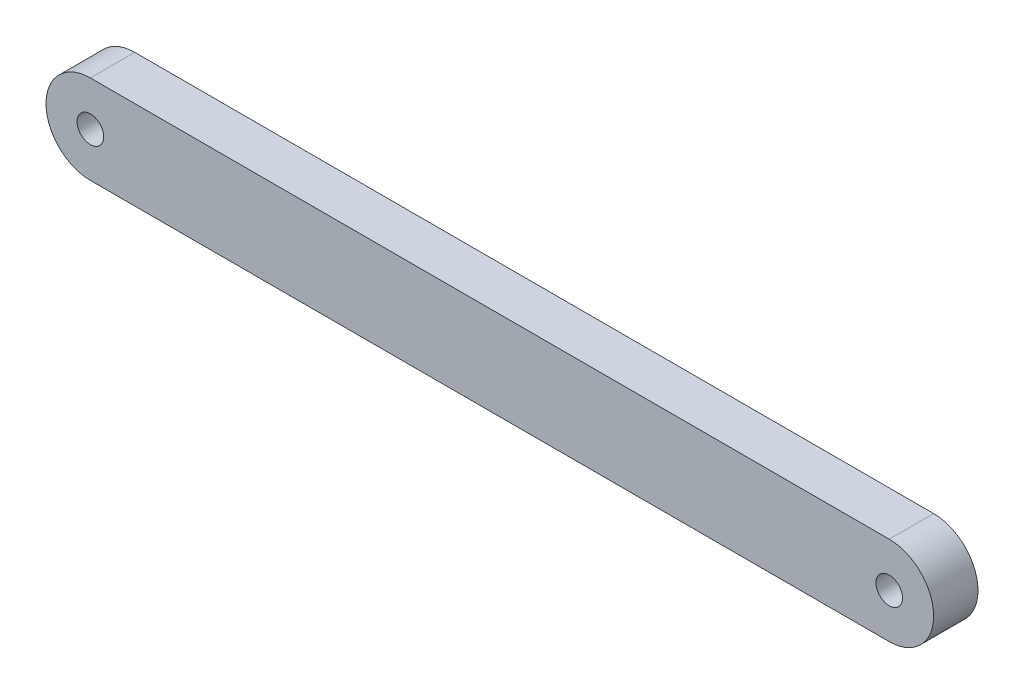
ISO-10303-21;
HEADER;
FILE_DESCRIPTION(('STEP AP214'),'2;1');
FILE_NAME('part.step','',(''),(''),'','','');
FILE_SCHEMA(('AUTOMOTIVE_DESIGN { 1 0 10303 214 1 1 1 1 }'));
ENDSEC;
DATA;
#1=APPLICATION_CONTEXT('core data for automotive mechanical design processes');
#2=APPLICATION_PROTOCOL_DEFINITION('international standard','automotive_design',2000,#1);
#3=PRODUCT_CONTEXT('',#1,'mechanical');
#4=PRODUCT('Part','Part','',(#3));
#5=PRODUCT_RELATED_PRODUCT_CATEGORY('part','',(#4));
#6=PRODUCT_DEFINITION_FORMATION('','',#4);
#7=PRODUCT_DEFINITION_CONTEXT('part definition',#1,'design');
#8=PRODUCT_DEFINITION('design','',#6,#7);
#9=PRODUCT_DEFINITION_SHAPE('','',#8);
#10=(LENGTH_UNIT() NAMED_UNIT(*) SI_UNIT(.MILLI.,.METRE.));
#11=(NAMED_UNIT(*) PLANE_ANGLE_UNIT() SI_UNIT($,.RADIAN.));
#12=(NAMED_UNIT(*) SI_UNIT($,.STERADIAN.) SOLID_ANGLE_UNIT());
#13=UNCERTAINTY_MEASURE_WITH_UNIT(LENGTH_MEASURE(1.E-05),#10,'distance_accuracy_value','');
#14=(GEOMETRIC_REPRESENTATION_CONTEXT(3) GLOBAL_UNCERTAINTY_ASSIGNED_CONTEXT((#13)) GLOBAL_UNIT_ASSIGNED_CONTEXT((#10,
#11,#12)) REPRESENTATION_CONTEXT('',''));
#15=CARTESIAN_POINT('',(0.,0.,0.));
#16=DIRECTION('',(0.,0.,1.));
#17=DIRECTION('',(1.,0.,0.));
#18=AXIS2_PLACEMENT_3D('',#15,#16,#17);
#19=CARTESIAN_POINT('',(-45.,0.,5.));
#20=DIRECTION('',(0.,0.,1.));
#21=DIRECTION('',(1.,0.,0.));
#22=AXIS2_PLACEMENT_3D('',#19,#20,#21);
#23=PLANE('',#22);
#24=CARTESIAN_POINT('',(-45.,0.,5.));
#25=DIRECTION('',(0.,0.,1.));
#26=DIRECTION('',(1.,0.,0.));
#27=AXIS2_PLACEMENT_3D('',#24,#25,#26);
#28=CIRCLE('',#27,1.5);
#29=CARTESIAN_POINT('',(-43.5,0.,5.));
#30=VERTEX_POINT('',#29);
#31=EDGE_CURVE('E100',#30,#30,#28,.T.);
#32=ORIENTED_EDGE('',*,*,#31,.F.);
#33=EDGE_LOOP('',(#32));
#34=FACE_BOUND('',#33,.T.);
#35=CARTESIAN_POINT('',(-45.,0.,5.));
#36=DIRECTION('',(0.,0.,1.));
#37=DIRECTION('',(1.,0.,0.));
#38=AXIS2_PLACEMENT_3D('',#35,#36,#37);
#39=CIRCLE('',#38,5.);
#40=CARTESIAN_POINT('',(-45.,5.,5.));
#41=VERTEX_POINT('',#40);
#42=CARTESIAN_POINT('',(-45.,-5.,5.));
#43=VERTEX_POINT('',#42);
#44=EDGE_CURVE('E85',#41,#43,#39,.T.);
#45=ORIENTED_EDGE('',*,*,#44,.T.);
#46=DIRECTION('',(1.,0.,0.));
#47=VECTOR('',#46,1.);
#48=CARTESIAN_POINT('',(-45.,-5.,5.));
#49=LINE('',#48,#47);
#50=CARTESIAN_POINT('',(45.,-5.,5.));
#51=VERTEX_POINT('',#50);
#52=EDGE_CURVE('E80',#43,#51,#49,.T.);
#53=ORIENTED_EDGE('',*,*,#52,.T.);
#54=CARTESIAN_POINT('',(45.,0.,5.));
#55=DIRECTION('',(0.,0.,1.));
#56=DIRECTION('',(1.,0.,0.));
#57=AXIS2_PLACEMENT_3D('',#54,#55,#56);
#58=CIRCLE('',#57,5.);
#59=CARTESIAN_POINT('',(45.,5.,5.));
#60=VERTEX_POINT('',#59);
#61=EDGE_CURVE('E83',#51,#60,#58,.T.);
#62=ORIENTED_EDGE('',*,*,#61,.T.);
#63=DIRECTION('',(-1.,0.,0.));
#64=VECTOR('',#63,1.);
#65=CARTESIAN_POINT('',(-45.,5.,5.));
#66=LINE('',#65,#64);
#67=EDGE_CURVE('E50',#60,#41,#66,.T.);
#68=ORIENTED_EDGE('',*,*,#67,.T.);
#69=EDGE_LOOP('',(#45,#53,#62,#68));
#70=FACE_BOUND('',#69,.T.);
#71=CARTESIAN_POINT('',(45.,0.,5.));
#72=DIRECTION('',(0.,0.,1.));
#73=DIRECTION('',(1.,0.,0.));
#74=AXIS2_PLACEMENT_3D('',#71,#72,#73);
#75=CIRCLE('',#74,1.5);
#76=CARTESIAN_POINT('',(46.5,0.,5.));
#77=VERTEX_POINT('',#76);
#78=EDGE_CURVE('E115',#77,#77,#75,.T.);
#79=ORIENTED_EDGE('',*,*,#78,.F.);
#80=EDGE_LOOP('',(#79));
#81=FACE_BOUND('',#80,.T.);
#82=ADVANCED_FACE('F33',(#34,#70,#81),#23,.T.);
#83=CARTESIAN_POINT('',(-45.,0.,0.));
#84=DIRECTION('',(0.,0.,1.));
#85=DIRECTION('',(1.,0.,0.));
#86=AXIS2_PLACEMENT_3D('',#83,#84,#85);
#87=PLANE('',#86);
#88=CARTESIAN_POINT('',(-45.,0.,0.));
#89=DIRECTION('',(0.,0.,1.));
#90=DIRECTION('',(1.,0.,0.));
#91=AXIS2_PLACEMENT_3D('',#88,#89,#90);
#92=CIRCLE('',#91,5.);
#93=CARTESIAN_POINT('',(-45.,5.,0.));
#94=VERTEX_POINT('',#93);
#95=CARTESIAN_POINT('',(-45.,-5.,0.));
#96=VERTEX_POINT('',#95);
#97=EDGE_CURVE('E97',#94,#96,#92,.T.);
#98=ORIENTED_EDGE('',*,*,#97,.F.);
#99=DIRECTION('',(-1.,0.,0.));
#100=VECTOR('',#99,1.);
#101=CARTESIAN_POINT('',(-45.,5.,0.));
#102=LINE('',#101,#100);
#103=CARTESIAN_POINT('',(45.,5.,0.));
#104=VERTEX_POINT('',#103);
#105=EDGE_CURVE('E73',#104,#94,#102,.T.);
#106=ORIENTED_EDGE('',*,*,#105,.F.);
#107=CARTESIAN_POINT('',(45.,0.,0.));
#108=DIRECTION('',(0.,0.,1.));
#109=DIRECTION('',(1.,0.,0.));
#110=AXIS2_PLACEMENT_3D('',#107,#108,#109);
#111=CIRCLE('',#110,5.);
#112=CARTESIAN_POINT('',(45.,-5.,0.));
#113=VERTEX_POINT('',#112);
#114=EDGE_CURVE('E67',#113,#104,#111,.T.);
#115=ORIENTED_EDGE('',*,*,#114,.F.);
#116=DIRECTION('',(1.,0.,0.));
#117=VECTOR('',#116,1.);
#118=CARTESIAN_POINT('',(-45.,-5.,0.));
#119=LINE('',#118,#117);
#120=EDGE_CURVE('E89',#96,#113,#119,.T.);
#121=ORIENTED_EDGE('',*,*,#120,.F.);
#122=EDGE_LOOP('',(#98,#106,#115,#121));
#123=FACE_BOUND('',#122,.T.);
#124=CARTESIAN_POINT('',(-45.,0.,0.));
#125=DIRECTION('',(0.,0.,1.));
#126=DIRECTION('',(1.,0.,0.));
#127=AXIS2_PLACEMENT_3D('',#124,#125,#126);
#128=CIRCLE('',#127,1.5);
#129=CARTESIAN_POINT('',(-43.5,0.,0.));
#130=VERTEX_POINT('',#129);
#131=EDGE_CURVE('E112',#130,#130,#128,.T.);
#132=ORIENTED_EDGE('',*,*,#131,.T.);
#133=EDGE_LOOP('',(#132));
#134=FACE_BOUND('',#133,.T.);
#135=CARTESIAN_POINT('',(45.,0.,0.));
#136=DIRECTION('',(0.,0.,1.));
#137=DIRECTION('',(1.,0.,0.));
#138=AXIS2_PLACEMENT_3D('',#135,#136,#137);
#139=CIRCLE('',#138,1.5);
#140=CARTESIAN_POINT('',(46.5,0.,0.));
#141=VERTEX_POINT('',#140);
#142=EDGE_CURVE('E118',#141,#141,#139,.T.);
#143=ORIENTED_EDGE('',*,*,#142,.T.);
#144=EDGE_LOOP('',(#143));
#145=FACE_BOUND('',#144,.T.);
#146=ADVANCED_FACE('F108',(#123,#134,#145),#87,.F.);
#147=CARTESIAN_POINT('',(-45.,0.,5.));
#148=DIRECTION('',(0.,0.,-1.));
#149=DIRECTION('',(-1.,0.,0.));
#150=AXIS2_PLACEMENT_3D('',#147,#148,#149);
#151=CYLINDRICAL_SURFACE('',#150,5.);
#152=ORIENTED_EDGE('',*,*,#97,.T.);
#153=DIRECTION('',(0.,0.,-1.));
#154=VECTOR('',#153,1.);
#155=CARTESIAN_POINT('',(-45.,-5.,5.));
#156=LINE('',#155,#154);
#157=EDGE_CURVE('E11',#43,#96,#156,.T.);
#158=ORIENTED_EDGE('',*,*,#157,.F.);
#159=ORIENTED_EDGE('',*,*,#44,.F.);
#160=DIRECTION('',(0.,0.,-1.));
#161=VECTOR('',#160,1.);
#162=CARTESIAN_POINT('',(-45.,5.,5.));
#163=LINE('',#162,#161);
#164=EDGE_CURVE('E93',#41,#94,#163,.T.);
#165=ORIENTED_EDGE('',*,*,#164,.T.);
#166=EDGE_LOOP('',(#152,#158,#159,#165));
#167=FACE_BOUND('',#166,.T.);
#168=ADVANCED_FACE('F35',(#167),#151,.T.);
#169=CARTESIAN_POINT('',(-45.,-5.,5.));
#170=DIRECTION('',(0.,1.,0.));
#171=DIRECTION('',(0.,0.,1.));
#172=AXIS2_PLACEMENT_3D('',#169,#170,#171);
#173=PLANE('',#172);
#174=ORIENTED_EDGE('',*,*,#120,.T.);
#175=DIRECTION('',(0.,0.,-1.));
#176=VECTOR('',#175,1.);
#177=CARTESIAN_POINT('',(45.,-5.,5.));
#178=LINE('',#177,#176);
#179=EDGE_CURVE('E42',#51,#113,#178,.T.);
#180=ORIENTED_EDGE('',*,*,#179,.F.);
#181=ORIENTED_EDGE('',*,*,#52,.F.);
#182=ORIENTED_EDGE('',*,*,#157,.T.);
#183=EDGE_LOOP('',(#174,#180,#181,#182));
#184=FACE_BOUND('',#183,.T.);
#185=ADVANCED_FACE('F88',(#184),#173,.F.);
#186=CARTESIAN_POINT('',(45.,0.,5.));
#187=DIRECTION('',(0.,0.,-1.));
#188=DIRECTION('',(-1.,0.,0.));
#189=AXIS2_PLACEMENT_3D('',#186,#187,#188);
#190=CYLINDRICAL_SURFACE('',#189,5.);
#191=ORIENTED_EDGE('',*,*,#114,.T.);
#192=DIRECTION('',(0.,0.,-1.));
#193=VECTOR('',#192,1.);
#194=CARTESIAN_POINT('',(45.,5.,5.));
#195=LINE('',#194,#193);
#196=EDGE_CURVE('E90',#60,#104,#195,.T.);
#197=ORIENTED_EDGE('',*,*,#196,.F.);
#198=ORIENTED_EDGE('',*,*,#61,.F.);
#199=ORIENTED_EDGE('',*,*,#179,.T.);
#200=EDGE_LOOP('',(#191,#197,#198,#199));
#201=FACE_BOUND('',#200,.T.);
#202=ADVANCED_FACE('F91',(#201),#190,.T.);
#203=CARTESIAN_POINT('',(-45.,5.,5.));
#204=DIRECTION('',(0.,-1.,0.));
#205=DIRECTION('',(0.,0.,-1.));
#206=AXIS2_PLACEMENT_3D('',#203,#204,#205);
#207=PLANE('',#206);
#208=ORIENTED_EDGE('',*,*,#105,.T.);
#209=ORIENTED_EDGE('',*,*,#164,.F.);
#210=ORIENTED_EDGE('',*,*,#67,.F.);
#211=ORIENTED_EDGE('',*,*,#196,.T.);
#212=EDGE_LOOP('',(#208,#209,#210,#211));
#213=FACE_BOUND('',#212,.T.);
#214=ADVANCED_FACE('F105',(#213),#207,.F.);
#215=CARTESIAN_POINT('',(-45.,0.,5.));
#216=DIRECTION('',(0.,0.,-1.));
#217=DIRECTION('',(-1.,0.,0.));
#218=AXIS2_PLACEMENT_3D('',#215,#216,#217);
#219=CYLINDRICAL_SURFACE('',#218,1.5);
#220=ORIENTED_EDGE('',*,*,#31,.T.);
#221=EDGE_LOOP('',(#220));
#222=FACE_BOUND('',#221,.T.);
#223=ORIENTED_EDGE('',*,*,#131,.F.);
#224=EDGE_LOOP('',(#223));
#225=FACE_BOUND('',#224,.T.);
#226=ADVANCED_FACE('F135',(#222,#225),#219,.F.);
#227=CARTESIAN_POINT('',(45.,0.,5.));
#228=DIRECTION('',(0.,0.,-1.));
#229=DIRECTION('',(-1.,0.,0.));
#230=AXIS2_PLACEMENT_3D('',#227,#228,#229);
#231=CYLINDRICAL_SURFACE('',#230,1.5);
#232=ORIENTED_EDGE('',*,*,#78,.T.);
#233=EDGE_LOOP('',(#232));
#234=FACE_BOUND('',#233,.T.);
#235=ORIENTED_EDGE('',*,*,#142,.F.);
#236=EDGE_LOOP('',(#235));
#237=FACE_BOUND('',#236,.T.);
#238=ADVANCED_FACE('F124',(#234,#237),#231,.F.);
#239=CLOSED_SHELL('',(#82,#146,#168,#185,#202,#214,#226,#238));
#240=MANIFOLD_SOLID_BREP('B2',#239);
#241=ADVANCED_BREP_SHAPE_REPRESENTATION('',(#18,#240),#14);
#242=SHAPE_DEFINITION_REPRESENTATION(#9,#241);
ENDSEC;
END-ISO-10303-21;
